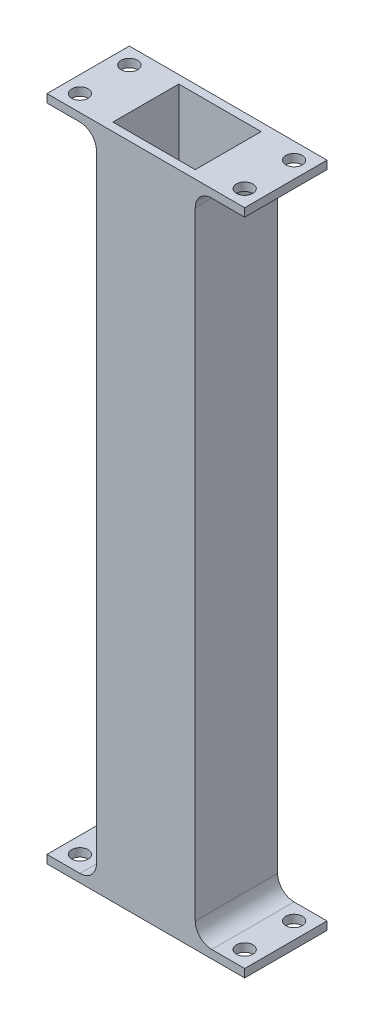
ISO-10303-21;
HEADER;
FILE_DESCRIPTION(('STEP AP214'),'2;1');
FILE_NAME('part.step','',(''),(''),'','','');
FILE_SCHEMA(('AUTOMOTIVE_DESIGN { 1 0 10303 214 1 1 1 1 }'));
ENDSEC;
DATA;
#1=APPLICATION_CONTEXT('core data for automotive mechanical design processes');
#2=APPLICATION_PROTOCOL_DEFINITION('international standard','automotive_design',2000,#1);
#3=PRODUCT_CONTEXT('',#1,'mechanical');
#4=PRODUCT('Part','Part','',(#3));
#5=PRODUCT_RELATED_PRODUCT_CATEGORY('part','',(#4));
#6=PRODUCT_DEFINITION_FORMATION('','',#4);
#7=PRODUCT_DEFINITION_CONTEXT('part definition',#1,'design');
#8=PRODUCT_DEFINITION('design','',#6,#7);
#9=PRODUCT_DEFINITION_SHAPE('','',#8);
#10=(LENGTH_UNIT() NAMED_UNIT(*) SI_UNIT(.MILLI.,.METRE.));
#11=(NAMED_UNIT(*) PLANE_ANGLE_UNIT() SI_UNIT($,.RADIAN.));
#12=(NAMED_UNIT(*) SI_UNIT($,.STERADIAN.) SOLID_ANGLE_UNIT());
#13=UNCERTAINTY_MEASURE_WITH_UNIT(LENGTH_MEASURE(1.E-05),#10,'distance_accuracy_value','');
#14=(GEOMETRIC_REPRESENTATION_CONTEXT(3) GLOBAL_UNCERTAINTY_ASSIGNED_CONTEXT((#13)) GLOBAL_UNIT_ASSIGNED_CONTEXT((#10,
#11,#12)) REPRESENTATION_CONTEXT('',''));
#15=CARTESIAN_POINT('',(0.,0.,0.));
#16=DIRECTION('',(0.,0.,1.));
#17=DIRECTION('',(1.,0.,0.));
#18=AXIS2_PLACEMENT_3D('',#15,#16,#17);
#19=CARTESIAN_POINT('',(-30.,200.,25.));
#20=DIRECTION('',(1.,0.,0.));
#21=DIRECTION('',(0.,0.,-1.));
#22=AXIS2_PLACEMENT_3D('',#19,#20,#21);
#23=PLANE('',#22);
#24=DIRECTION('',(0.,-1.,0.));
#25=VECTOR('',#24,1.);
#26=CARTESIAN_POINT('',(-30.,200.,-25.));
#27=LINE('',#26,#25);
#28=CARTESIAN_POINT('',(-30.,187.5,-25.));
#29=VERTEX_POINT('',#28);
#30=CARTESIAN_POINT('',(-30.,-187.5,-25.));
#31=VERTEX_POINT('',#30);
#32=EDGE_CURVE('E387',#29,#31,#27,.T.);
#33=ORIENTED_EDGE('',*,*,#32,.T.);
#34=DIRECTION('',(0.,0.,-1.));
#35=VECTOR('',#34,1.);
#36=CARTESIAN_POINT('',(-30.,-187.5,25.));
#37=LINE('',#36,#35);
#38=CARTESIAN_POINT('',(-30.,-187.5,25.));
#39=VERTEX_POINT('',#38);
#40=EDGE_CURVE('E433',#31,#39,#37,.F.);
#41=ORIENTED_EDGE('',*,*,#40,.T.);
#42=DIRECTION('',(0.,-1.,0.));
#43=VECTOR('',#42,1.);
#44=CARTESIAN_POINT('',(-30.,200.,25.));
#45=LINE('',#44,#43);
#46=CARTESIAN_POINT('',(-30.,187.5,25.));
#47=VERTEX_POINT('',#46);
#48=EDGE_CURVE('E399',#47,#39,#45,.T.);
#49=ORIENTED_EDGE('',*,*,#48,.F.);
#50=DIRECTION('',(0.,0.,1.));
#51=VECTOR('',#50,1.);
#52=CARTESIAN_POINT('',(-30.,187.5,-25.));
#53=LINE('',#52,#51);
#54=EDGE_CURVE('E407',#47,#29,#53,.F.);
#55=ORIENTED_EDGE('',*,*,#54,.T.);
#56=EDGE_LOOP('',(#33,#41,#49,#55));
#57=FACE_BOUND('',#56,.T.);
#58=ADVANCED_FACE('F44',(#57),#23,.F.);
#59=CARTESIAN_POINT('',(30.,200.,25.));
#60=DIRECTION('',(-1.,0.,0.));
#61=DIRECTION('',(0.,0.,1.));
#62=AXIS2_PLACEMENT_3D('',#59,#60,#61);
#63=PLANE('',#62);
#64=DIRECTION('',(0.,-1.,0.));
#65=VECTOR('',#64,1.);
#66=CARTESIAN_POINT('',(30.,200.,25.));
#67=LINE('',#66,#65);
#68=CARTESIAN_POINT('',(30.,187.5,25.));
#69=VERTEX_POINT('',#68);
#70=CARTESIAN_POINT('',(30.,-187.5,25.));
#71=VERTEX_POINT('',#70);
#72=EDGE_CURVE('E395',#69,#71,#67,.T.);
#73=ORIENTED_EDGE('',*,*,#72,.T.);
#74=DIRECTION('',(0.,0.,1.));
#75=VECTOR('',#74,1.);
#76=CARTESIAN_POINT('',(30.,-187.5,-25.));
#77=LINE('',#76,#75);
#78=CARTESIAN_POINT('',(30.,-187.5,-25.));
#79=VERTEX_POINT('',#78);
#80=EDGE_CURVE('E440',#71,#79,#77,.F.);
#81=ORIENTED_EDGE('',*,*,#80,.T.);
#82=DIRECTION('',(0.,-1.,0.));
#83=VECTOR('',#82,1.);
#84=CARTESIAN_POINT('',(30.,200.,-25.));
#85=LINE('',#84,#83);
#86=CARTESIAN_POINT('',(30.,187.5,-25.));
#87=VERTEX_POINT('',#86);
#88=EDGE_CURVE('E391',#87,#79,#85,.T.);
#89=ORIENTED_EDGE('',*,*,#88,.F.);
#90=DIRECTION('',(0.,0.,-1.));
#91=VECTOR('',#90,1.);
#92=CARTESIAN_POINT('',(30.,187.5,25.));
#93=LINE('',#92,#91);
#94=EDGE_CURVE('E414',#87,#69,#93,.F.);
#95=ORIENTED_EDGE('',*,*,#94,.T.);
#96=EDGE_LOOP('',(#73,#81,#89,#95));
#97=FACE_BOUND('',#96,.T.);
#98=ADVANCED_FACE('F458',(#97),#63,.F.);
#99=CARTESIAN_POINT('',(30.,200.,25.));
#100=DIRECTION('',(0.,0.,-1.));
#101=DIRECTION('',(-1.,0.,0.));
#102=AXIS2_PLACEMENT_3D('',#99,#100,#101);
#103=PLANE('',#102);
#104=DIRECTION('',(1.,0.,0.));
#105=VECTOR('',#104,1.);
#106=CARTESIAN_POINT('',(60.,-197.5,25.));
#107=LINE('',#106,#105);
#108=CARTESIAN_POINT('',(40.,-197.5,25.));
#109=VERTEX_POINT('',#108);
#110=CARTESIAN_POINT('',(60.,-197.5,25.));
#111=VERTEX_POINT('',#110);
#112=EDGE_CURVE('E292',#109,#111,#107,.T.);
#113=ORIENTED_EDGE('',*,*,#112,.F.);
#114=CARTESIAN_POINT('',(40.,-187.5,25.));
#115=DIRECTION('',(0.,0.,-1.));
#116=DIRECTION('',(-1.,0.,0.));
#117=AXIS2_PLACEMENT_3D('',#114,#115,#116);
#118=CIRCLE('',#117,10.);
#119=EDGE_CURVE('E53',#109,#71,#118,.T.);
#120=ORIENTED_EDGE('',*,*,#119,.T.);
#121=ORIENTED_EDGE('',*,*,#72,.F.);
#122=CARTESIAN_POINT('',(40.,187.5,25.));
#123=DIRECTION('',(0.,0.,-1.));
#124=DIRECTION('',(-1.,0.,0.));
#125=AXIS2_PLACEMENT_3D('',#122,#123,#124);
#126=CIRCLE('',#125,10.);
#127=CARTESIAN_POINT('',(40.,197.5,25.));
#128=VERTEX_POINT('',#127);
#129=EDGE_CURVE('E426',#69,#128,#126,.T.);
#130=ORIENTED_EDGE('',*,*,#129,.T.);
#131=DIRECTION('',(1.,0.,0.));
#132=VECTOR('',#131,1.);
#133=CARTESIAN_POINT('',(60.,197.5,25.));
#134=LINE('',#133,#132);
#135=CARTESIAN_POINT('',(60.,197.5,25.));
#136=VERTEX_POINT('',#135);
#137=EDGE_CURVE('E360',#128,#136,#134,.T.);
#138=ORIENTED_EDGE('',*,*,#137,.T.);
#139=DIRECTION('',(0.,-1.,0.));
#140=VECTOR('',#139,1.);
#141=CARTESIAN_POINT('',(60.,202.5,25.));
#142=LINE('',#141,#140);
#143=CARTESIAN_POINT('',(60.,202.5,25.));
#144=VERTEX_POINT('',#143);
#145=EDGE_CURVE('E379',#144,#136,#142,.T.);
#146=ORIENTED_EDGE('',*,*,#145,.F.);
#147=DIRECTION('',(1.,0.,0.));
#148=VECTOR('',#147,1.);
#149=CARTESIAN_POINT('',(60.,202.5,25.));
#150=LINE('',#149,#148);
#151=CARTESIAN_POINT('',(-60.,202.5,25.));
#152=VERTEX_POINT('',#151);
#153=EDGE_CURVE('E346',#152,#144,#150,.T.);
#154=ORIENTED_EDGE('',*,*,#153,.F.);
#155=DIRECTION('',(0.,-1.,0.));
#156=VECTOR('',#155,1.);
#157=CARTESIAN_POINT('',(-60.,202.5,25.));
#158=LINE('',#157,#156);
#159=CARTESIAN_POINT('',(-60.,197.5,25.));
#160=VERTEX_POINT('',#159);
#161=EDGE_CURVE('E383',#152,#160,#158,.T.);
#162=ORIENTED_EDGE('',*,*,#161,.T.);
#163=CARTESIAN_POINT('',(-40.,197.5,25.));
#164=VERTEX_POINT('',#163);
#165=EDGE_CURVE('E361',#160,#164,#134,.T.);
#166=ORIENTED_EDGE('',*,*,#165,.T.);
#167=CARTESIAN_POINT('',(-40.,187.5,25.));
#168=DIRECTION('',(0.,0.,-1.));
#169=DIRECTION('',(-1.,0.,0.));
#170=AXIS2_PLACEMENT_3D('',#167,#168,#169);
#171=CIRCLE('',#170,10.);
#172=EDGE_CURVE('E417',#164,#47,#171,.T.);
#173=ORIENTED_EDGE('',*,*,#172,.T.);
#174=ORIENTED_EDGE('',*,*,#48,.T.);
#175=CARTESIAN_POINT('',(-40.,-187.5,25.));
#176=DIRECTION('',(0.,0.,-1.));
#177=DIRECTION('',(-1.,0.,0.));
#178=AXIS2_PLACEMENT_3D('',#175,#176,#177);
#179=CIRCLE('',#178,10.);
#180=CARTESIAN_POINT('',(-40.,-197.5,25.));
#181=VERTEX_POINT('',#180);
#182=EDGE_CURVE('E446',#39,#181,#179,.T.);
#183=ORIENTED_EDGE('',*,*,#182,.T.);
#184=CARTESIAN_POINT('',(-60.,-197.5,25.));
#185=VERTEX_POINT('',#184);
#186=EDGE_CURVE('E267',#185,#181,#107,.T.);
#187=ORIENTED_EDGE('',*,*,#186,.F.);
#188=DIRECTION('',(0.,1.,0.));
#189=VECTOR('',#188,1.);
#190=CARTESIAN_POINT('',(-60.,-202.5,25.));
#191=LINE('',#190,#189);
#192=CARTESIAN_POINT('',(-60.,-202.5,25.));
#193=VERTEX_POINT('',#192);
#194=EDGE_CURVE('E279',#193,#185,#191,.T.);
#195=ORIENTED_EDGE('',*,*,#194,.F.);
#196=DIRECTION('',(1.,0.,0.));
#197=VECTOR('',#196,1.);
#198=CARTESIAN_POINT('',(60.,-202.5,25.));
#199=LINE('',#198,#197);
#200=CARTESIAN_POINT('',(60.,-202.5,25.));
#201=VERTEX_POINT('',#200);
#202=EDGE_CURVE('E275',#193,#201,#199,.T.);
#203=ORIENTED_EDGE('',*,*,#202,.T.);
#204=DIRECTION('',(0.,1.,0.));
#205=VECTOR('',#204,1.);
#206=CARTESIAN_POINT('',(60.,-202.5,25.));
#207=LINE('',#206,#205);
#208=EDGE_CURVE('E298',#201,#111,#207,.T.);
#209=ORIENTED_EDGE('',*,*,#208,.T.);
#210=EDGE_LOOP('',(#113,#120,#121,#130,#138,#146,#154,#162,#166,#173,#174,#183,#187,#195,#203,#209));
#211=FACE_BOUND('',#210,.T.);
#212=ADVANCED_FACE('F452',(#211),#103,.F.);
#213=CARTESIAN_POINT('',(30.,200.,-25.));
#214=DIRECTION('',(0.,0.,1.));
#215=DIRECTION('',(1.,0.,0.));
#216=AXIS2_PLACEMENT_3D('',#213,#214,#215);
#217=PLANE('',#216);
#218=DIRECTION('',(-1.,0.,0.));
#219=VECTOR('',#218,1.);
#220=CARTESIAN_POINT('',(60.,-197.5,-25.));
#221=LINE('',#220,#219);
#222=CARTESIAN_POINT('',(-40.,-197.5,-25.));
#223=VERTEX_POINT('',#222);
#224=CARTESIAN_POINT('',(-60.,-197.5,-25.));
#225=VERTEX_POINT('',#224);
#226=EDGE_CURVE('E283',#223,#225,#221,.T.);
#227=ORIENTED_EDGE('',*,*,#226,.F.);
#228=CARTESIAN_POINT('',(-40.,-187.5,-25.));
#229=DIRECTION('',(0.,0.,1.));
#230=DIRECTION('',(1.,0.,0.));
#231=AXIS2_PLACEMENT_3D('',#228,#229,#230);
#232=CIRCLE('',#231,10.);
#233=EDGE_CURVE('E443',#223,#31,#232,.T.);
#234=ORIENTED_EDGE('',*,*,#233,.T.);
#235=ORIENTED_EDGE('',*,*,#32,.F.);
#236=CARTESIAN_POINT('',(-40.,187.5,-25.));
#237=DIRECTION('',(0.,0.,1.));
#238=DIRECTION('',(1.,0.,0.));
#239=AXIS2_PLACEMENT_3D('',#236,#237,#238);
#240=CIRCLE('',#239,10.);
#241=CARTESIAN_POINT('',(-40.,197.5,-25.));
#242=VERTEX_POINT('',#241);
#243=EDGE_CURVE('E420',#29,#242,#240,.T.);
#244=ORIENTED_EDGE('',*,*,#243,.T.);
#245=DIRECTION('',(-1.,0.,0.));
#246=VECTOR('',#245,1.);
#247=CARTESIAN_POINT('',(60.,197.5,-25.));
#248=LINE('',#247,#246);
#249=CARTESIAN_POINT('',(-60.,197.5,-25.));
#250=VERTEX_POINT('',#249);
#251=EDGE_CURVE('E368',#242,#250,#248,.T.);
#252=ORIENTED_EDGE('',*,*,#251,.T.);
#253=DIRECTION('',(0.,-1.,0.));
#254=VECTOR('',#253,1.);
#255=CARTESIAN_POINT('',(-60.,202.5,-25.));
#256=LINE('',#255,#254);
#257=CARTESIAN_POINT('',(-60.,202.5,-25.));
#258=VERTEX_POINT('',#257);
#259=EDGE_CURVE('E356',#258,#250,#256,.T.);
#260=ORIENTED_EDGE('',*,*,#259,.F.);
#261=DIRECTION('',(-1.,0.,0.));
#262=VECTOR('',#261,1.);
#263=CARTESIAN_POINT('',(60.,202.5,-25.));
#264=LINE('',#263,#262);
#265=CARTESIAN_POINT('',(60.,202.5,-25.));
#266=VERTEX_POINT('',#265);
#267=EDGE_CURVE('E353',#266,#258,#264,.T.);
#268=ORIENTED_EDGE('',*,*,#267,.F.);
#269=DIRECTION('',(0.,-1.,0.));
#270=VECTOR('',#269,1.);
#271=CARTESIAN_POINT('',(60.,202.5,-25.));
#272=LINE('',#271,#270);
#273=CARTESIAN_POINT('',(60.,197.5,-25.));
#274=VERTEX_POINT('',#273);
#275=EDGE_CURVE('E375',#266,#274,#272,.T.);
#276=ORIENTED_EDGE('',*,*,#275,.T.);
#277=CARTESIAN_POINT('',(40.,197.5,-25.));
#278=VERTEX_POINT('',#277);
#279=EDGE_CURVE('E347',#274,#278,#248,.T.);
#280=ORIENTED_EDGE('',*,*,#279,.T.);
#281=CARTESIAN_POINT('',(40.,187.5,-25.));
#282=DIRECTION('',(0.,0.,1.));
#283=DIRECTION('',(1.,0.,0.));
#284=AXIS2_PLACEMENT_3D('',#281,#282,#283);
#285=CIRCLE('',#284,10.);
#286=EDGE_CURVE('E423',#278,#87,#285,.T.);
#287=ORIENTED_EDGE('',*,*,#286,.T.);
#288=ORIENTED_EDGE('',*,*,#88,.T.);
#289=CARTESIAN_POINT('',(40.,-187.5,-25.));
#290=DIRECTION('',(0.,0.,1.));
#291=DIRECTION('',(1.,0.,0.));
#292=AXIS2_PLACEMENT_3D('',#289,#290,#291);
#293=CIRCLE('',#292,10.);
#294=CARTESIAN_POINT('',(40.,-197.5,-25.));
#295=VERTEX_POINT('',#294);
#296=EDGE_CURVE('E11',#79,#295,#293,.T.);
#297=ORIENTED_EDGE('',*,*,#296,.T.);
#298=CARTESIAN_POINT('',(60.,-197.5,-25.));
#299=VERTEX_POINT('',#298);
#300=EDGE_CURVE('E284',#299,#295,#221,.T.);
#301=ORIENTED_EDGE('',*,*,#300,.F.);
#302=DIRECTION('',(0.,1.,0.));
#303=VECTOR('',#302,1.);
#304=CARTESIAN_POINT('',(60.,-202.5,-25.));
#305=LINE('',#304,#303);
#306=CARTESIAN_POINT('',(60.,-202.5,-25.));
#307=VERTEX_POINT('',#306);
#308=EDGE_CURVE('E302',#307,#299,#305,.T.);
#309=ORIENTED_EDGE('',*,*,#308,.F.);
#310=DIRECTION('',(-1.,0.,0.));
#311=VECTOR('',#310,1.);
#312=CARTESIAN_POINT('',(60.,-202.5,-25.));
#313=LINE('',#312,#311);
#314=CARTESIAN_POINT('',(-60.,-202.5,-25.));
#315=VERTEX_POINT('',#314);
#316=EDGE_CURVE('E266',#307,#315,#313,.T.);
#317=ORIENTED_EDGE('',*,*,#316,.T.);
#318=DIRECTION('',(0.,1.,0.));
#319=VECTOR('',#318,1.);
#320=CARTESIAN_POINT('',(-60.,-202.5,-25.));
#321=LINE('',#320,#319);
#322=EDGE_CURVE('E305',#315,#225,#321,.T.);
#323=ORIENTED_EDGE('',*,*,#322,.T.);
#324=EDGE_LOOP('',(#227,#234,#235,#244,#252,#260,#268,#276,#280,#287,#288,#297,#301,#309,#317,#323));
#325=FACE_BOUND('',#324,.T.);
#326=ADVANCED_FACE('F465',(#325),#217,.F.);
#327=CARTESIAN_POINT('',(0.,197.5,0.));
#328=DIRECTION('',(0.,1.,0.));
#329=DIRECTION('',(0.,0.,1.));
#330=AXIS2_PLACEMENT_3D('',#327,#328,#329);
#331=PLANE('',#330);
#332=CARTESIAN_POINT('',(-50.0000000000002,197.5,14.9999999999996));
#333=DIRECTION('',(0.,-1.,0.));
#334=DIRECTION('',(0.,0.,1.));
#335=AXIS2_PLACEMENT_3D('',#332,#333,#334);
#336=CIRCLE('',#335,5.);
#337=CARTESIAN_POINT('',(-50.0000000000002,197.5,19.9999999999996));
#338=VERTEX_POINT('',#337);
#339=EDGE_CURVE('E327',#338,#338,#336,.T.);
#340=ORIENTED_EDGE('',*,*,#339,.F.);
#341=EDGE_LOOP('',(#340));
#342=FACE_BOUND('',#341,.T.);
#343=CARTESIAN_POINT('',(-50.,197.5,-15.0000000000004));
#344=DIRECTION('',(0.,-1.,0.));
#345=DIRECTION('',(0.,0.,-1.));
#346=AXIS2_PLACEMENT_3D('',#343,#344,#345);
#347=CIRCLE('',#346,4.99999999999998);
#348=CARTESIAN_POINT('',(-50.,197.5,-20.0000000000004));
#349=VERTEX_POINT('',#348);
#350=EDGE_CURVE('E310',#349,#349,#347,.T.);
#351=ORIENTED_EDGE('',*,*,#350,.F.);
#352=EDGE_LOOP('',(#351));
#353=FACE_BOUND('',#352,.T.);
#354=ORIENTED_EDGE('',*,*,#251,.F.);
#355=DIRECTION('',(0.,0.,1.));
#356=VECTOR('',#355,1.);
#357=CARTESIAN_POINT('',(-40.,197.5,25.));
#358=LINE('',#357,#356);
#359=EDGE_CURVE('E403',#242,#164,#358,.T.);
#360=ORIENTED_EDGE('',*,*,#359,.T.);
#361=ORIENTED_EDGE('',*,*,#165,.F.);
#362=DIRECTION('',(0.,0.,1.));
#363=VECTOR('',#362,1.);
#364=CARTESIAN_POINT('',(-60.,197.5,25.));
#365=LINE('',#364,#363);
#366=EDGE_CURVE('E338',#250,#160,#365,.T.);
#367=ORIENTED_EDGE('',*,*,#366,.F.);
#368=EDGE_LOOP('',(#354,#360,#361,#367));
#369=FACE_BOUND('',#368,.T.);
#370=ADVANCED_FACE('F497',(#342,#353,#369),#331,.F.);
#371=CARTESIAN_POINT('',(50.,197.5,-15.));
#372=DIRECTION('',(0.,-1.,0.));
#373=DIRECTION('',(0.,0.,1.));
#374=AXIS2_PLACEMENT_3D('',#371,#372,#373);
#375=CIRCLE('',#374,5.);
#376=CARTESIAN_POINT('',(50.,197.5,-10.));
#377=VERTEX_POINT('',#376);
#378=EDGE_CURVE('E318',#377,#377,#375,.T.);
#379=ORIENTED_EDGE('',*,*,#378,.F.);
#380=EDGE_LOOP('',(#379));
#381=FACE_BOUND('',#380,.T.);
#382=CARTESIAN_POINT('',(50.,197.5,15.));
#383=DIRECTION('',(0.,-1.,0.));
#384=DIRECTION('',(0.,0.,-1.));
#385=AXIS2_PLACEMENT_3D('',#382,#383,#384);
#386=CIRCLE('',#385,5.);
#387=CARTESIAN_POINT('',(50.,197.5,10.));
#388=VERTEX_POINT('',#387);
#389=EDGE_CURVE('E322',#388,#388,#386,.T.);
#390=ORIENTED_EDGE('',*,*,#389,.F.);
#391=EDGE_LOOP('',(#390));
#392=FACE_BOUND('',#391,.T.);
#393=ORIENTED_EDGE('',*,*,#137,.F.);
#394=DIRECTION('',(0.,0.,-1.));
#395=VECTOR('',#394,1.);
#396=CARTESIAN_POINT('',(40.,197.5,-25.));
#397=LINE('',#396,#395);
#398=EDGE_CURVE('E410',#128,#278,#397,.T.);
#399=ORIENTED_EDGE('',*,*,#398,.T.);
#400=ORIENTED_EDGE('',*,*,#279,.F.);
#401=DIRECTION('',(0.,0.,-1.));
#402=VECTOR('',#401,1.);
#403=CARTESIAN_POINT('',(60.,197.5,25.));
#404=LINE('',#403,#402);
#405=EDGE_CURVE('E365',#136,#274,#404,.T.);
#406=ORIENTED_EDGE('',*,*,#405,.F.);
#407=EDGE_LOOP('',(#393,#399,#400,#406));
#408=FACE_BOUND('',#407,.T.);
#409=ADVANCED_FACE('F507',(#381,#392,#408),#331,.F.);
#410=CARTESIAN_POINT('',(-60.,202.5,25.));
#411=DIRECTION('',(1.,0.,0.));
#412=DIRECTION('',(0.,0.,-1.));
#413=AXIS2_PLACEMENT_3D('',#410,#411,#412);
#414=PLANE('',#413);
#415=ORIENTED_EDGE('',*,*,#366,.T.);
#416=ORIENTED_EDGE('',*,*,#161,.F.);
#417=DIRECTION('',(0.,0.,1.));
#418=VECTOR('',#417,1.);
#419=CARTESIAN_POINT('',(-60.,202.5,25.));
#420=LINE('',#419,#418);
#421=EDGE_CURVE('E342',#258,#152,#420,.T.);
#422=ORIENTED_EDGE('',*,*,#421,.F.);
#423=ORIENTED_EDGE('',*,*,#259,.T.);
#424=EDGE_LOOP('',(#415,#416,#422,#423));
#425=FACE_BOUND('',#424,.T.);
#426=ADVANCED_FACE('F495',(#425),#414,.F.);
#427=CARTESIAN_POINT('',(60.,202.5,25.));
#428=DIRECTION('',(-1.,0.,0.));
#429=DIRECTION('',(0.,0.,1.));
#430=AXIS2_PLACEMENT_3D('',#427,#428,#429);
#431=PLANE('',#430);
#432=ORIENTED_EDGE('',*,*,#405,.T.);
#433=ORIENTED_EDGE('',*,*,#275,.F.);
#434=DIRECTION('',(0.,0.,-1.));
#435=VECTOR('',#434,1.);
#436=CARTESIAN_POINT('',(60.,202.5,25.));
#437=LINE('',#436,#435);
#438=EDGE_CURVE('E350',#144,#266,#437,.T.);
#439=ORIENTED_EDGE('',*,*,#438,.F.);
#440=ORIENTED_EDGE('',*,*,#145,.T.);
#441=EDGE_LOOP('',(#432,#433,#439,#440));
#442=FACE_BOUND('',#441,.T.);
#443=ADVANCED_FACE('F511',(#442),#431,.F.);
#444=CARTESIAN_POINT('',(0.,202.5,0.));
#445=DIRECTION('',(0.,1.,0.));
#446=DIRECTION('',(0.,0.,1.));
#447=AXIS2_PLACEMENT_3D('',#444,#445,#446);
#448=PLANE('',#447);
#449=DIRECTION('',(-1.,0.,0.));
#450=VECTOR('',#449,1.);
#451=CARTESIAN_POINT('',(25.,202.5,20.));
#452=LINE('',#451,#450);
#453=CARTESIAN_POINT('',(25.,202.5,20.));
#454=VERTEX_POINT('',#453);
#455=CARTESIAN_POINT('',(-25.,202.5,20.));
#456=VERTEX_POINT('',#455);
#457=EDGE_CURVE('E183',#454,#456,#452,.T.);
#458=ORIENTED_EDGE('',*,*,#457,.T.);
#459=DIRECTION('',(0.,0.,-1.));
#460=VECTOR('',#459,1.);
#461=CARTESIAN_POINT('',(-25.,202.5,20.));
#462=LINE('',#461,#460);
#463=CARTESIAN_POINT('',(-25.,202.5,-20.));
#464=VERTEX_POINT('',#463);
#465=EDGE_CURVE('E193',#456,#464,#462,.T.);
#466=ORIENTED_EDGE('',*,*,#465,.T.);
#467=DIRECTION('',(1.,0.,0.));
#468=VECTOR('',#467,1.);
#469=CARTESIAN_POINT('',(-25.,202.5,-20.));
#470=LINE('',#469,#468);
#471=CARTESIAN_POINT('',(25.,202.5,-20.));
#472=VERTEX_POINT('',#471);
#473=EDGE_CURVE('E60',#464,#472,#470,.T.);
#474=ORIENTED_EDGE('',*,*,#473,.T.);
#475=DIRECTION('',(0.,0.,1.));
#476=VECTOR('',#475,1.);
#477=CARTESIAN_POINT('',(25.,202.5,-20.));
#478=LINE('',#477,#476);
#479=EDGE_CURVE('E190',#472,#454,#478,.T.);
#480=ORIENTED_EDGE('',*,*,#479,.T.);
#481=EDGE_LOOP('',(#458,#466,#474,#480));
#482=FACE_BOUND('',#481,.T.);
#483=CARTESIAN_POINT('',(50.,202.5,-15.));
#484=DIRECTION('',(0.,-1.,0.));
#485=DIRECTION('',(0.,0.,1.));
#486=AXIS2_PLACEMENT_3D('',#483,#484,#485);
#487=CIRCLE('',#486,5.);
#488=CARTESIAN_POINT('',(50.,202.5,-10.));
#489=VERTEX_POINT('',#488);
#490=EDGE_CURVE('E323',#489,#489,#487,.T.);
#491=ORIENTED_EDGE('',*,*,#490,.T.);
#492=EDGE_LOOP('',(#491));
#493=FACE_BOUND('',#492,.T.);
#494=CARTESIAN_POINT('',(-50.0000000000002,202.5,14.9999999999996));
#495=DIRECTION('',(0.,-1.,0.));
#496=DIRECTION('',(0.,0.,1.));
#497=AXIS2_PLACEMENT_3D('',#494,#495,#496);
#498=CIRCLE('',#497,5.);
#499=CARTESIAN_POINT('',(-50.0000000000002,202.5,19.9999999999996));
#500=VERTEX_POINT('',#499);
#501=EDGE_CURVE('E314',#500,#500,#498,.T.);
#502=ORIENTED_EDGE('',*,*,#501,.T.);
#503=EDGE_LOOP('',(#502));
#504=FACE_BOUND('',#503,.T.);
#505=CARTESIAN_POINT('',(-50.,202.5,-15.0000000000004));
#506=DIRECTION('',(0.,-1.,0.));
#507=DIRECTION('',(0.,0.,-1.));
#508=AXIS2_PLACEMENT_3D('',#505,#506,#507);
#509=CIRCLE('',#508,4.99999999999998);
#510=CARTESIAN_POINT('',(-50.,202.5,-20.0000000000004));
#511=VERTEX_POINT('',#510);
#512=EDGE_CURVE('E309',#511,#511,#509,.T.);
#513=ORIENTED_EDGE('',*,*,#512,.T.);
#514=EDGE_LOOP('',(#513));
#515=FACE_BOUND('',#514,.T.);
#516=CARTESIAN_POINT('',(50.,202.5,15.));
#517=DIRECTION('',(0.,-1.,0.));
#518=DIRECTION('',(0.,0.,-1.));
#519=AXIS2_PLACEMENT_3D('',#516,#517,#518);
#520=CIRCLE('',#519,5.);
#521=CARTESIAN_POINT('',(50.,202.5,10.));
#522=VERTEX_POINT('',#521);
#523=EDGE_CURVE('E334',#522,#522,#520,.T.);
#524=ORIENTED_EDGE('',*,*,#523,.T.);
#525=EDGE_LOOP('',(#524));
#526=FACE_BOUND('',#525,.T.);
#527=ORIENTED_EDGE('',*,*,#421,.T.);
#528=ORIENTED_EDGE('',*,*,#153,.T.);
#529=ORIENTED_EDGE('',*,*,#438,.T.);
#530=ORIENTED_EDGE('',*,*,#267,.T.);
#531=EDGE_LOOP('',(#527,#528,#529,#530));
#532=FACE_BOUND('',#531,.T.);
#533=ADVANCED_FACE('F198',(#482,#493,#504,#515,#526,#532),#448,.T.);
#534=CARTESIAN_POINT('',(-40.,187.5,0.));
#535=DIRECTION('',(0.,0.,-1.));
#536=DIRECTION('',(-1.,0.,0.));
#537=AXIS2_PLACEMENT_3D('',#534,#535,#536);
#538=CYLINDRICAL_SURFACE('',#537,10.);
#539=ORIENTED_EDGE('',*,*,#243,.F.);
#540=ORIENTED_EDGE('',*,*,#54,.F.);
#541=ORIENTED_EDGE('',*,*,#172,.F.);
#542=ORIENTED_EDGE('',*,*,#359,.F.);
#543=EDGE_LOOP('',(#539,#540,#541,#542));
#544=FACE_BOUND('',#543,.T.);
#545=ADVANCED_FACE('F519',(#544),#538,.F.);
#546=CARTESIAN_POINT('',(40.,187.5,0.));
#547=DIRECTION('',(0.,0.,1.));
#548=DIRECTION('',(1.,0.,0.));
#549=AXIS2_PLACEMENT_3D('',#546,#547,#548);
#550=CYLINDRICAL_SURFACE('',#549,10.);
#551=ORIENTED_EDGE('',*,*,#129,.F.);
#552=ORIENTED_EDGE('',*,*,#94,.F.);
#553=ORIENTED_EDGE('',*,*,#286,.F.);
#554=ORIENTED_EDGE('',*,*,#398,.F.);
#555=EDGE_LOOP('',(#551,#552,#553,#554));
#556=FACE_BOUND('',#555,.T.);
#557=ADVANCED_FACE('F510',(#556),#550,.F.);
#558=CARTESIAN_POINT('',(50.,202.5,15.));
#559=DIRECTION('',(0.,-1.,0.));
#560=DIRECTION('',(0.,0.,-1.));
#561=AXIS2_PLACEMENT_3D('',#558,#559,#560);
#562=CYLINDRICAL_SURFACE('',#561,5.);
#563=ORIENTED_EDGE('',*,*,#523,.F.);
#564=EDGE_LOOP('',(#563));
#565=FACE_BOUND('',#564,.T.);
#566=ORIENTED_EDGE('',*,*,#389,.T.);
#567=EDGE_LOOP('',(#566));
#568=FACE_BOUND('',#567,.T.);
#569=ADVANCED_FACE('F536',(#565,#568),#562,.F.);
#570=CARTESIAN_POINT('',(-50.,202.5,-15.0000000000004));
#571=DIRECTION('',(0.,-1.,0.));
#572=DIRECTION('',(0.,0.,-1.));
#573=AXIS2_PLACEMENT_3D('',#570,#571,#572);
#574=CYLINDRICAL_SURFACE('',#573,4.99999999999998);
#575=ORIENTED_EDGE('',*,*,#512,.F.);
#576=EDGE_LOOP('',(#575));
#577=FACE_BOUND('',#576,.T.);
#578=ORIENTED_EDGE('',*,*,#350,.T.);
#579=EDGE_LOOP('',(#578));
#580=FACE_BOUND('',#579,.T.);
#581=ADVANCED_FACE('F572',(#577,#580),#574,.F.);
#582=CARTESIAN_POINT('',(-50.0000000000002,202.5,14.9999999999996));
#583=DIRECTION('',(0.,-1.,0.));
#584=DIRECTION('',(0.,0.,-1.));
#585=AXIS2_PLACEMENT_3D('',#582,#583,#584);
#586=CYLINDRICAL_SURFACE('',#585,5.);
#587=ORIENTED_EDGE('',*,*,#501,.F.);
#588=EDGE_LOOP('',(#587));
#589=FACE_BOUND('',#588,.T.);
#590=ORIENTED_EDGE('',*,*,#339,.T.);
#591=EDGE_LOOP('',(#590));
#592=FACE_BOUND('',#591,.T.);
#593=ADVANCED_FACE('F563',(#589,#592),#586,.F.);
#594=CARTESIAN_POINT('',(50.,202.5,-15.));
#595=DIRECTION('',(0.,-1.,0.));
#596=DIRECTION('',(0.,0.,-1.));
#597=AXIS2_PLACEMENT_3D('',#594,#595,#596);
#598=CYLINDRICAL_SURFACE('',#597,5.);
#599=ORIENTED_EDGE('',*,*,#490,.F.);
#600=EDGE_LOOP('',(#599));
#601=FACE_BOUND('',#600,.T.);
#602=ORIENTED_EDGE('',*,*,#378,.T.);
#603=EDGE_LOOP('',(#602));
#604=FACE_BOUND('',#603,.T.);
#605=ADVANCED_FACE('F555',(#601,#604),#598,.F.);
#606=CARTESIAN_POINT('',(0.,-197.5,0.));
#607=DIRECTION('',(0.,-1.,0.));
#608=DIRECTION('',(0.,0.,1.));
#609=AXIS2_PLACEMENT_3D('',#606,#607,#608);
#610=PLANE('',#609);
#611=CARTESIAN_POINT('',(-50.0000000000002,-197.5,14.9999999999996));
#612=DIRECTION('',(0.,-1.,0.));
#613=DIRECTION('',(0.,0.,1.));
#614=AXIS2_PLACEMENT_3D('',#611,#612,#613);
#615=CIRCLE('',#614,5.);
#616=CARTESIAN_POINT('',(-50.0000000000002,-197.5,19.9999999999996));
#617=VERTEX_POINT('',#616);
#618=EDGE_CURVE('E234',#617,#617,#615,.T.);
#619=ORIENTED_EDGE('',*,*,#618,.T.);
#620=EDGE_LOOP('',(#619));
#621=FACE_BOUND('',#620,.T.);
#622=CARTESIAN_POINT('',(-50.,-197.5,-15.0000000000004));
#623=DIRECTION('',(0.,-1.,0.));
#624=DIRECTION('',(0.,0.,-1.));
#625=AXIS2_PLACEMENT_3D('',#622,#623,#624);
#626=CIRCLE('',#625,4.99999999999998);
#627=CARTESIAN_POINT('',(-50.,-197.5,-20.0000000000004));
#628=VERTEX_POINT('',#627);
#629=EDGE_CURVE('E224',#628,#628,#626,.T.);
#630=ORIENTED_EDGE('',*,*,#629,.T.);
#631=EDGE_LOOP('',(#630));
#632=FACE_BOUND('',#631,.T.);
#633=ORIENTED_EDGE('',*,*,#186,.T.);
#634=DIRECTION('',(0.,0.,-1.));
#635=VECTOR('',#634,1.);
#636=CARTESIAN_POINT('',(-40.,-197.5,-25.));
#637=LINE('',#636,#635);
#638=EDGE_CURVE('E429',#181,#223,#637,.T.);
#639=ORIENTED_EDGE('',*,*,#638,.T.);
#640=ORIENTED_EDGE('',*,*,#226,.T.);
#641=DIRECTION('',(0.,0.,1.));
#642=VECTOR('',#641,1.);
#643=CARTESIAN_POINT('',(-60.,-197.5,25.));
#644=LINE('',#643,#642);
#645=EDGE_CURVE('E258',#225,#185,#644,.T.);
#646=ORIENTED_EDGE('',*,*,#645,.T.);
#647=EDGE_LOOP('',(#633,#639,#640,#646));
#648=FACE_BOUND('',#647,.T.);
#649=ADVANCED_FACE('F553',(#621,#632,#648),#610,.F.);
#650=CARTESIAN_POINT('',(50.,-197.5,-15.));
#651=DIRECTION('',(0.,-1.,0.));
#652=DIRECTION('',(0.,0.,1.));
#653=AXIS2_PLACEMENT_3D('',#650,#651,#652);
#654=CIRCLE('',#653,5.);
#655=CARTESIAN_POINT('',(50.,-197.5,-10.));
#656=VERTEX_POINT('',#655);
#657=EDGE_CURVE('E243',#656,#656,#654,.T.);
#658=ORIENTED_EDGE('',*,*,#657,.T.);
#659=EDGE_LOOP('',(#658));
#660=FACE_BOUND('',#659,.T.);
#661=CARTESIAN_POINT('',(50.,-197.5,15.));
#662=DIRECTION('',(0.,-1.,0.));
#663=DIRECTION('',(0.,0.,-1.));
#664=AXIS2_PLACEMENT_3D('',#661,#662,#663);
#665=CIRCLE('',#664,5.);
#666=CARTESIAN_POINT('',(50.,-197.5,10.));
#667=VERTEX_POINT('',#666);
#668=EDGE_CURVE('E242',#667,#667,#665,.T.);
#669=ORIENTED_EDGE('',*,*,#668,.T.);
#670=EDGE_LOOP('',(#669));
#671=FACE_BOUND('',#670,.T.);
#672=ORIENTED_EDGE('',*,*,#300,.T.);
#673=DIRECTION('',(0.,0.,1.));
#674=VECTOR('',#673,1.);
#675=CARTESIAN_POINT('',(40.,-197.5,25.));
#676=LINE('',#675,#674);
#677=EDGE_CURVE('E436',#295,#109,#676,.T.);
#678=ORIENTED_EDGE('',*,*,#677,.T.);
#679=ORIENTED_EDGE('',*,*,#112,.T.);
#680=DIRECTION('',(0.,0.,-1.));
#681=VECTOR('',#680,1.);
#682=CARTESIAN_POINT('',(60.,-197.5,25.));
#683=LINE('',#682,#681);
#684=EDGE_CURVE('E288',#111,#299,#683,.T.);
#685=ORIENTED_EDGE('',*,*,#684,.T.);
#686=EDGE_LOOP('',(#672,#678,#679,#685));
#687=FACE_BOUND('',#686,.T.);
#688=ADVANCED_FACE('F467',(#660,#671,#687),#610,.F.);
#689=CARTESIAN_POINT('',(-60.,-202.5,25.));
#690=DIRECTION('',(-1.,0.,0.));
#691=DIRECTION('',(0.,0.,1.));
#692=AXIS2_PLACEMENT_3D('',#689,#690,#691);
#693=PLANE('',#692);
#694=ORIENTED_EDGE('',*,*,#645,.F.);
#695=ORIENTED_EDGE('',*,*,#322,.F.);
#696=DIRECTION('',(0.,0.,1.));
#697=VECTOR('',#696,1.);
#698=CARTESIAN_POINT('',(-60.,-202.5,25.));
#699=LINE('',#698,#697);
#700=EDGE_CURVE('E262',#315,#193,#699,.T.);
#701=ORIENTED_EDGE('',*,*,#700,.T.);
#702=ORIENTED_EDGE('',*,*,#194,.T.);
#703=EDGE_LOOP('',(#694,#695,#701,#702));
#704=FACE_BOUND('',#703,.T.);
#705=ADVANCED_FACE('F479',(#704),#693,.T.);
#706=CARTESIAN_POINT('',(60.,-202.5,25.));
#707=DIRECTION('',(1.,0.,0.));
#708=DIRECTION('',(0.,0.,-1.));
#709=AXIS2_PLACEMENT_3D('',#706,#707,#708);
#710=PLANE('',#709);
#711=ORIENTED_EDGE('',*,*,#684,.F.);
#712=ORIENTED_EDGE('',*,*,#208,.F.);
#713=DIRECTION('',(0.,0.,-1.));
#714=VECTOR('',#713,1.);
#715=CARTESIAN_POINT('',(60.,-202.5,25.));
#716=LINE('',#715,#714);
#717=EDGE_CURVE('E271',#201,#307,#716,.T.);
#718=ORIENTED_EDGE('',*,*,#717,.T.);
#719=ORIENTED_EDGE('',*,*,#308,.T.);
#720=EDGE_LOOP('',(#711,#712,#718,#719));
#721=FACE_BOUND('',#720,.T.);
#722=ADVANCED_FACE('F470',(#721),#710,.T.);
#723=CARTESIAN_POINT('',(0.,-202.5,0.));
#724=DIRECTION('',(0.,-1.,0.));
#725=DIRECTION('',(0.,0.,1.));
#726=AXIS2_PLACEMENT_3D('',#723,#724,#725);
#727=PLANE('',#726);
#728=DIRECTION('',(-1.,0.,0.));
#729=VECTOR('',#728,1.);
#730=CARTESIAN_POINT('',(25.,-202.5,20.));
#731=LINE('',#730,#729);
#732=CARTESIAN_POINT('',(25.,-202.5,20.));
#733=VERTEX_POINT('',#732);
#734=CARTESIAN_POINT('',(-25.,-202.5,20.));
#735=VERTEX_POINT('',#734);
#736=EDGE_CURVE('E68',#733,#735,#731,.T.);
#737=ORIENTED_EDGE('',*,*,#736,.F.);
#738=DIRECTION('',(0.,0.,1.));
#739=VECTOR('',#738,1.);
#740=CARTESIAN_POINT('',(25.,-202.5,-20.));
#741=LINE('',#740,#739);
#742=CARTESIAN_POINT('',(25.,-202.5,-20.));
#743=VERTEX_POINT('',#742);
#744=EDGE_CURVE('E202',#743,#733,#741,.T.);
#745=ORIENTED_EDGE('',*,*,#744,.F.);
#746=DIRECTION('',(1.,0.,0.));
#747=VECTOR('',#746,1.);
#748=CARTESIAN_POINT('',(-25.,-202.5,-20.));
#749=LINE('',#748,#747);
#750=CARTESIAN_POINT('',(-25.,-202.5,-20.));
#751=VERTEX_POINT('',#750);
#752=EDGE_CURVE('E206',#751,#743,#749,.T.);
#753=ORIENTED_EDGE('',*,*,#752,.F.);
#754=DIRECTION('',(0.,0.,-1.));
#755=VECTOR('',#754,1.);
#756=CARTESIAN_POINT('',(-25.,-202.5,20.));
#757=LINE('',#756,#755);
#758=EDGE_CURVE('E215',#735,#751,#757,.T.);
#759=ORIENTED_EDGE('',*,*,#758,.F.);
#760=EDGE_LOOP('',(#737,#745,#753,#759));
#761=FACE_BOUND('',#760,.T.);
#762=CARTESIAN_POINT('',(50.,-202.5,-15.));
#763=DIRECTION('',(0.,-1.,0.));
#764=DIRECTION('',(0.,0.,1.));
#765=AXIS2_PLACEMENT_3D('',#762,#763,#764);
#766=CIRCLE('',#765,5.);
#767=CARTESIAN_POINT('',(50.,-202.5,-10.));
#768=VERTEX_POINT('',#767);
#769=EDGE_CURVE('E238',#768,#768,#766,.T.);
#770=ORIENTED_EDGE('',*,*,#769,.F.);
#771=EDGE_LOOP('',(#770));
#772=FACE_BOUND('',#771,.T.);
#773=CARTESIAN_POINT('',(-50.0000000000002,-202.5,14.9999999999996));
#774=DIRECTION('',(0.,-1.,0.));
#775=DIRECTION('',(0.,0.,1.));
#776=AXIS2_PLACEMENT_3D('',#773,#774,#775);
#777=CIRCLE('',#776,5.);
#778=CARTESIAN_POINT('',(-50.0000000000002,-202.5,19.9999999999996));
#779=VERTEX_POINT('',#778);
#780=EDGE_CURVE('E247',#779,#779,#777,.T.);
#781=ORIENTED_EDGE('',*,*,#780,.F.);
#782=EDGE_LOOP('',(#781));
#783=FACE_BOUND('',#782,.T.);
#784=CARTESIAN_POINT('',(-50.,-202.5,-15.0000000000004));
#785=DIRECTION('',(0.,-1.,0.));
#786=DIRECTION('',(0.,0.,-1.));
#787=AXIS2_PLACEMENT_3D('',#784,#785,#786);
#788=CIRCLE('',#787,4.99999999999998);
#789=CARTESIAN_POINT('',(-50.,-202.5,-20.0000000000004));
#790=VERTEX_POINT('',#789);
#791=EDGE_CURVE('E230',#790,#790,#788,.T.);
#792=ORIENTED_EDGE('',*,*,#791,.F.);
#793=EDGE_LOOP('',(#792));
#794=FACE_BOUND('',#793,.T.);
#795=CARTESIAN_POINT('',(50.,-202.5,15.));
#796=DIRECTION('',(0.,-1.,0.));
#797=DIRECTION('',(0.,0.,-1.));
#798=AXIS2_PLACEMENT_3D('',#795,#796,#797);
#799=CIRCLE('',#798,5.);
#800=CARTESIAN_POINT('',(50.,-202.5,10.));
#801=VERTEX_POINT('',#800);
#802=EDGE_CURVE('E254',#801,#801,#799,.T.);
#803=ORIENTED_EDGE('',*,*,#802,.F.);
#804=EDGE_LOOP('',(#803));
#805=FACE_BOUND('',#804,.T.);
#806=ORIENTED_EDGE('',*,*,#700,.F.);
#807=ORIENTED_EDGE('',*,*,#316,.F.);
#808=ORIENTED_EDGE('',*,*,#717,.F.);
#809=ORIENTED_EDGE('',*,*,#202,.F.);
#810=EDGE_LOOP('',(#806,#807,#808,#809));
#811=FACE_BOUND('',#810,.T.);
#812=ADVANCED_FACE('F475',(#761,#772,#783,#794,#805,#811),#727,.T.);
#813=CARTESIAN_POINT('',(-40.,-187.5,0.));
#814=DIRECTION('',(0.,0.,1.));
#815=DIRECTION('',(1.,0.,0.));
#816=AXIS2_PLACEMENT_3D('',#813,#814,#815);
#817=CYLINDRICAL_SURFACE('',#816,10.);
#818=ORIENTED_EDGE('',*,*,#182,.F.);
#819=ORIENTED_EDGE('',*,*,#40,.F.);
#820=ORIENTED_EDGE('',*,*,#233,.F.);
#821=ORIENTED_EDGE('',*,*,#638,.F.);
#822=EDGE_LOOP('',(#818,#819,#820,#821));
#823=FACE_BOUND('',#822,.T.);
#824=ADVANCED_FACE('F537',(#823),#817,.F.);
#825=CARTESIAN_POINT('',(40.,-187.5,0.));
#826=DIRECTION('',(0.,0.,-1.));
#827=DIRECTION('',(-1.,0.,0.));
#828=AXIS2_PLACEMENT_3D('',#825,#826,#827);
#829=CYLINDRICAL_SURFACE('',#828,10.);
#830=ORIENTED_EDGE('',*,*,#296,.F.);
#831=ORIENTED_EDGE('',*,*,#80,.F.);
#832=ORIENTED_EDGE('',*,*,#119,.F.);
#833=ORIENTED_EDGE('',*,*,#677,.F.);
#834=EDGE_LOOP('',(#830,#831,#832,#833));
#835=FACE_BOUND('',#834,.T.);
#836=ADVANCED_FACE('F46',(#835),#829,.F.);
#837=CARTESIAN_POINT('',(50.,-202.5,15.));
#838=DIRECTION('',(0.,1.,0.));
#839=DIRECTION('',(0.,0.,1.));
#840=AXIS2_PLACEMENT_3D('',#837,#838,#839);
#841=CYLINDRICAL_SURFACE('',#840,5.);
#842=ORIENTED_EDGE('',*,*,#802,.T.);
#843=EDGE_LOOP('',(#842));
#844=FACE_BOUND('',#843,.T.);
#845=ORIENTED_EDGE('',*,*,#668,.F.);
#846=EDGE_LOOP('',(#845));
#847=FACE_BOUND('',#846,.T.);
#848=ADVANCED_FACE('F544',(#844,#847),#841,.F.);
#849=CARTESIAN_POINT('',(-50.,-202.5,-15.0000000000004));
#850=DIRECTION('',(0.,1.,0.));
#851=DIRECTION('',(0.,0.,1.));
#852=AXIS2_PLACEMENT_3D('',#849,#850,#851);
#853=CYLINDRICAL_SURFACE('',#852,4.99999999999998);
#854=ORIENTED_EDGE('',*,*,#791,.T.);
#855=EDGE_LOOP('',(#854));
#856=FACE_BOUND('',#855,.T.);
#857=ORIENTED_EDGE('',*,*,#629,.F.);
#858=EDGE_LOOP('',(#857));
#859=FACE_BOUND('',#858,.T.);
#860=ADVANCED_FACE('F654',(#856,#859),#853,.F.);
#861=CARTESIAN_POINT('',(-50.0000000000002,-202.5,14.9999999999996));
#862=DIRECTION('',(0.,1.,0.));
#863=DIRECTION('',(0.,0.,1.));
#864=AXIS2_PLACEMENT_3D('',#861,#862,#863);
#865=CYLINDRICAL_SURFACE('',#864,5.);
#866=ORIENTED_EDGE('',*,*,#780,.T.);
#867=EDGE_LOOP('',(#866));
#868=FACE_BOUND('',#867,.T.);
#869=ORIENTED_EDGE('',*,*,#618,.F.);
#870=EDGE_LOOP('',(#869));
#871=FACE_BOUND('',#870,.T.);
#872=ADVANCED_FACE('F662',(#868,#871),#865,.F.);
#873=CARTESIAN_POINT('',(50.,-202.5,-15.));
#874=DIRECTION('',(0.,1.,0.));
#875=DIRECTION('',(0.,0.,1.));
#876=AXIS2_PLACEMENT_3D('',#873,#874,#875);
#877=CYLINDRICAL_SURFACE('',#876,5.);
#878=ORIENTED_EDGE('',*,*,#769,.T.);
#879=EDGE_LOOP('',(#878));
#880=FACE_BOUND('',#879,.T.);
#881=ORIENTED_EDGE('',*,*,#657,.F.);
#882=EDGE_LOOP('',(#881));
#883=FACE_BOUND('',#882,.T.);
#884=ADVANCED_FACE('F671',(#880,#883),#877,.F.);
#885=CARTESIAN_POINT('',(25.,202.5,20.));
#886=DIRECTION('',(0.,0.,1.));
#887=DIRECTION('',(1.,0.,0.));
#888=AXIS2_PLACEMENT_3D('',#885,#886,#887);
#889=PLANE('',#888);
#890=ORIENTED_EDGE('',*,*,#736,.T.);
#891=DIRECTION('',(0.,-1.,0.));
#892=VECTOR('',#891,1.);
#893=CARTESIAN_POINT('',(-25.,202.5,20.));
#894=LINE('',#893,#892);
#895=EDGE_CURVE('E179',#456,#735,#894,.T.);
#896=ORIENTED_EDGE('',*,*,#895,.F.);
#897=ORIENTED_EDGE('',*,*,#457,.F.);
#898=DIRECTION('',(0.,-1.,0.));
#899=VECTOR('',#898,1.);
#900=CARTESIAN_POINT('',(25.,202.5,20.));
#901=LINE('',#900,#899);
#902=EDGE_CURVE('E221',#454,#733,#901,.T.);
#903=ORIENTED_EDGE('',*,*,#902,.T.);
#904=EDGE_LOOP('',(#890,#896,#897,#903));
#905=FACE_BOUND('',#904,.T.);
#906=ADVANCED_FACE('F181',(#905),#889,.F.);
#907=CARTESIAN_POINT('',(25.,202.5,-20.));
#908=DIRECTION('',(1.,0.,0.));
#909=DIRECTION('',(0.,0.,-1.));
#910=AXIS2_PLACEMENT_3D('',#907,#908,#909);
#911=PLANE('',#910);
#912=ORIENTED_EDGE('',*,*,#744,.T.);
#913=ORIENTED_EDGE('',*,*,#902,.F.);
#914=ORIENTED_EDGE('',*,*,#479,.F.);
#915=DIRECTION('',(0.,-1.,0.));
#916=VECTOR('',#915,1.);
#917=CARTESIAN_POINT('',(25.,202.5,-20.));
#918=LINE('',#917,#916);
#919=EDGE_CURVE('E225',#472,#743,#918,.T.);
#920=ORIENTED_EDGE('',*,*,#919,.T.);
#921=EDGE_LOOP('',(#912,#913,#914,#920));
#922=FACE_BOUND('',#921,.T.);
#923=ADVANCED_FACE('F688',(#922),#911,.F.);
#924=CARTESIAN_POINT('',(-25.,202.5,-20.));
#925=DIRECTION('',(0.,0.,-1.));
#926=DIRECTION('',(-1.,0.,0.));
#927=AXIS2_PLACEMENT_3D('',#924,#925,#926);
#928=PLANE('',#927);
#929=ORIENTED_EDGE('',*,*,#752,.T.);
#930=ORIENTED_EDGE('',*,*,#919,.F.);
#931=ORIENTED_EDGE('',*,*,#473,.F.);
#932=DIRECTION('',(0.,-1.,0.));
#933=VECTOR('',#932,1.);
#934=CARTESIAN_POINT('',(-25.,202.5,-20.));
#935=LINE('',#934,#933);
#936=EDGE_CURVE('E189',#464,#751,#935,.T.);
#937=ORIENTED_EDGE('',*,*,#936,.T.);
#938=EDGE_LOOP('',(#929,#930,#931,#937));
#939=FACE_BOUND('',#938,.T.);
#940=ADVANCED_FACE('F696',(#939),#928,.F.);
#941=CARTESIAN_POINT('',(-25.,202.5,20.));
#942=DIRECTION('',(-1.,0.,0.));
#943=DIRECTION('',(0.,0.,1.));
#944=AXIS2_PLACEMENT_3D('',#941,#942,#943);
#945=PLANE('',#944);
#946=ORIENTED_EDGE('',*,*,#758,.T.);
#947=ORIENTED_EDGE('',*,*,#936,.F.);
#948=ORIENTED_EDGE('',*,*,#465,.F.);
#949=ORIENTED_EDGE('',*,*,#895,.T.);
#950=EDGE_LOOP('',(#946,#947,#948,#949));
#951=FACE_BOUND('',#950,.T.);
#952=ADVANCED_FACE('F194',(#951),#945,.F.);
#953=CLOSED_SHELL('',(#58,#98,#212,#326,#370,#409,#426,#443,#533,#545,#557,#569,#581,#593,#605,
#649,#688,#705,#722,#812,#824,#836,#848,#860,#872,#884,#906,#923,#940,#952));
#954=MANIFOLD_SOLID_BREP('B2',#953);
#955=ADVANCED_BREP_SHAPE_REPRESENTATION('',(#18,#954),#14);
#956=SHAPE_DEFINITION_REPRESENTATION(#9,#955);
ENDSEC;
END-ISO-10303-21;
